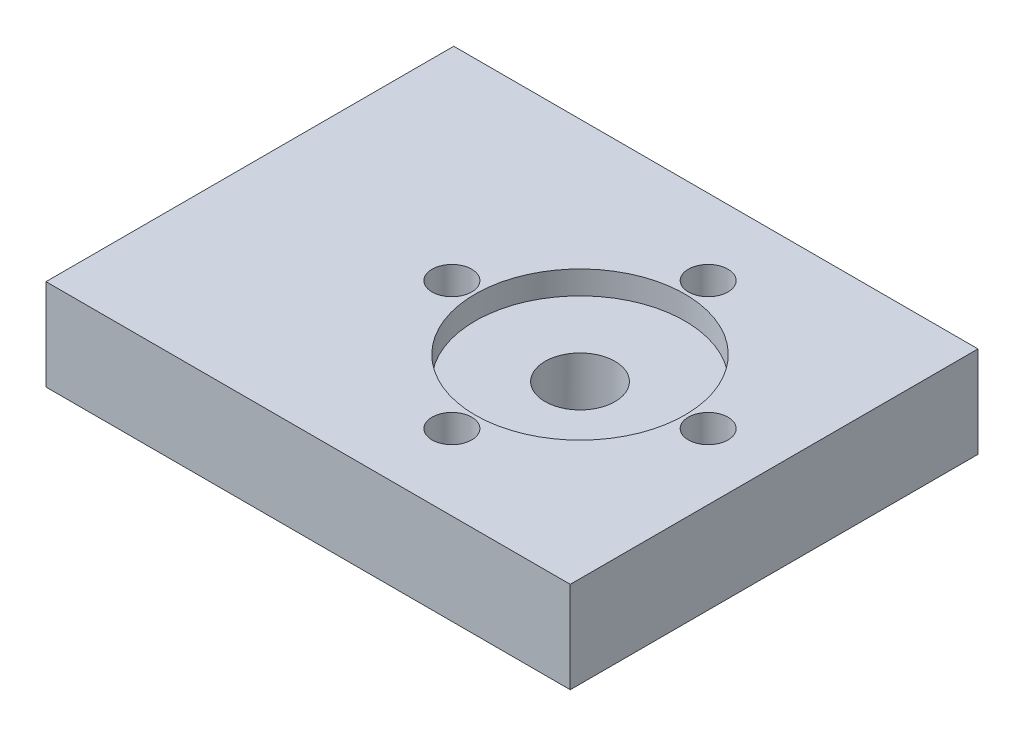
ISO-10303-21;
HEADER;
FILE_DESCRIPTION(('STEP AP214'),'2;1');
FILE_NAME('part.step','',(''),(''),'','','');
FILE_SCHEMA(('AUTOMOTIVE_DESIGN { 1 0 10303 214 1 1 1 1 }'));
ENDSEC;
DATA;
#1=APPLICATION_CONTEXT('core data for automotive mechanical design processes');
#2=APPLICATION_PROTOCOL_DEFINITION('international standard','automotive_design',2000,#1);
#3=PRODUCT_CONTEXT('',#1,'mechanical');
#4=PRODUCT('Part','Part','',(#3));
#5=PRODUCT_RELATED_PRODUCT_CATEGORY('part','',(#4));
#6=PRODUCT_DEFINITION_FORMATION('','',#4);
#7=PRODUCT_DEFINITION_CONTEXT('part definition',#1,'design');
#8=PRODUCT_DEFINITION('design','',#6,#7);
#9=PRODUCT_DEFINITION_SHAPE('','',#8);
#10=(LENGTH_UNIT() NAMED_UNIT(*) SI_UNIT(.MILLI.,.METRE.));
#11=(NAMED_UNIT(*) PLANE_ANGLE_UNIT() SI_UNIT($,.RADIAN.));
#12=(NAMED_UNIT(*) SI_UNIT($,.STERADIAN.) SOLID_ANGLE_UNIT());
#13=UNCERTAINTY_MEASURE_WITH_UNIT(LENGTH_MEASURE(1.E-05),#10,'distance_accuracy_value','');
#14=(GEOMETRIC_REPRESENTATION_CONTEXT(3) GLOBAL_UNCERTAINTY_ASSIGNED_CONTEXT((#13)) GLOBAL_UNIT_ASSIGNED_CONTEXT((#10,
#11,#12)) REPRESENTATION_CONTEXT('',''));
#15=CARTESIAN_POINT('',(0.,0.,0.));
#16=DIRECTION('',(0.,0.,1.));
#17=DIRECTION('',(1.,0.,0.));
#18=AXIS2_PLACEMENT_3D('',#15,#16,#17);
#19=CARTESIAN_POINT('',(22.5,7.83844459402521,17.5));
#20=DIRECTION('',(-1.,0.,0.));
#21=DIRECTION('',(0.,0.,1.));
#22=AXIS2_PLACEMENT_3D('',#19,#20,#21);
#23=PLANE('',#22);
#24=DIRECTION('',(0.,0.,-1.));
#25=VECTOR('',#24,1.);
#26=CARTESIAN_POINT('',(22.5,0.,17.5));
#27=LINE('',#26,#25);
#28=CARTESIAN_POINT('',(22.5,0.,17.5));
#29=VERTEX_POINT('',#28);
#30=CARTESIAN_POINT('',(22.5,0.,-17.5));
#31=VERTEX_POINT('',#30);
#32=EDGE_CURVE('E115',#29,#31,#27,.T.);
#33=ORIENTED_EDGE('',*,*,#32,.T.);
#34=DIRECTION('',(0.,-1.,0.));
#35=VECTOR('',#34,1.);
#36=CARTESIAN_POINT('',(22.5,7.83844459402521,-17.5));
#37=LINE('',#36,#35);
#38=CARTESIAN_POINT('',(22.5,7.83844459402521,-17.5));
#39=VERTEX_POINT('',#38);
#40=EDGE_CURVE('E11',#39,#31,#37,.T.);
#41=ORIENTED_EDGE('',*,*,#40,.F.);
#42=DIRECTION('',(0.,0.,-1.));
#43=VECTOR('',#42,1.);
#44=CARTESIAN_POINT('',(22.5,7.83844459402521,17.5));
#45=LINE('',#44,#43);
#46=CARTESIAN_POINT('',(22.5,7.83844459402521,17.5));
#47=VERTEX_POINT('',#46);
#48=EDGE_CURVE('E98',#47,#39,#45,.T.);
#49=ORIENTED_EDGE('',*,*,#48,.F.);
#50=DIRECTION('',(0.,-1.,0.));
#51=VECTOR('',#50,1.);
#52=CARTESIAN_POINT('',(22.5,7.83844459402521,17.5));
#53=LINE('',#52,#51);
#54=EDGE_CURVE('E111',#47,#29,#53,.T.);
#55=ORIENTED_EDGE('',*,*,#54,.T.);
#56=EDGE_LOOP('',(#33,#41,#49,#55));
#57=FACE_BOUND('',#56,.T.);
#58=ADVANCED_FACE('F45',(#57),#23,.F.);
#59=CARTESIAN_POINT('',(-22.5,7.83844459402521,-17.5));
#60=DIRECTION('',(0.,0.,1.));
#61=DIRECTION('',(1.,0.,0.));
#62=AXIS2_PLACEMENT_3D('',#59,#60,#61);
#63=PLANE('',#62);
#64=DIRECTION('',(-1.,0.,0.));
#65=VECTOR('',#64,1.);
#66=CARTESIAN_POINT('',(-22.5,0.,-17.5));
#67=LINE('',#66,#65);
#68=CARTESIAN_POINT('',(-22.5,0.,-17.5));
#69=VERTEX_POINT('',#68);
#70=EDGE_CURVE('E103',#31,#69,#67,.T.);
#71=ORIENTED_EDGE('',*,*,#70,.T.);
#72=DIRECTION('',(0.,-1.,0.));
#73=VECTOR('',#72,1.);
#74=CARTESIAN_POINT('',(-22.5,7.83844459402521,-17.5));
#75=LINE('',#74,#73);
#76=CARTESIAN_POINT('',(-22.5,7.83844459402521,-17.5));
#77=VERTEX_POINT('',#76);
#78=EDGE_CURVE('E55',#77,#69,#75,.T.);
#79=ORIENTED_EDGE('',*,*,#78,.F.);
#80=DIRECTION('',(-1.,0.,0.));
#81=VECTOR('',#80,1.);
#82=CARTESIAN_POINT('',(-22.5,7.83844459402521,-17.5));
#83=LINE('',#82,#81);
#84=EDGE_CURVE('E93',#39,#77,#83,.T.);
#85=ORIENTED_EDGE('',*,*,#84,.F.);
#86=ORIENTED_EDGE('',*,*,#40,.T.);
#87=EDGE_LOOP('',(#71,#79,#85,#86));
#88=FACE_BOUND('',#87,.T.);
#89=ADVANCED_FACE('F102',(#88),#63,.F.);
#90=CARTESIAN_POINT('',(-22.5,7.83844459402521,17.5));
#91=DIRECTION('',(1.,0.,0.));
#92=DIRECTION('',(0.,0.,-1.));
#93=AXIS2_PLACEMENT_3D('',#90,#91,#92);
#94=PLANE('',#93);
#95=DIRECTION('',(0.,0.,1.));
#96=VECTOR('',#95,1.);
#97=CARTESIAN_POINT('',(-22.5,0.,17.5));
#98=LINE('',#97,#96);
#99=CARTESIAN_POINT('',(-22.5,0.,17.5));
#100=VERTEX_POINT('',#99);
#101=EDGE_CURVE('E80',#69,#100,#98,.T.);
#102=ORIENTED_EDGE('',*,*,#101,.T.);
#103=DIRECTION('',(0.,-1.,0.));
#104=VECTOR('',#103,1.);
#105=CARTESIAN_POINT('',(-22.5,7.83844459402521,17.5));
#106=LINE('',#105,#104);
#107=CARTESIAN_POINT('',(-22.5,7.83844459402521,17.5));
#108=VERTEX_POINT('',#107);
#109=EDGE_CURVE('E105',#108,#100,#106,.T.);
#110=ORIENTED_EDGE('',*,*,#109,.F.);
#111=DIRECTION('',(0.,0.,1.));
#112=VECTOR('',#111,1.);
#113=CARTESIAN_POINT('',(-22.5,7.83844459402521,17.5));
#114=LINE('',#113,#112);
#115=EDGE_CURVE('E96',#77,#108,#114,.T.);
#116=ORIENTED_EDGE('',*,*,#115,.F.);
#117=ORIENTED_EDGE('',*,*,#78,.T.);
#118=EDGE_LOOP('',(#102,#110,#116,#117));
#119=FACE_BOUND('',#118,.T.);
#120=ADVANCED_FACE('F107',(#119),#94,.F.);
#121=CARTESIAN_POINT('',(-22.5,7.83844459402521,17.5));
#122=DIRECTION('',(0.,0.,-1.));
#123=DIRECTION('',(-1.,0.,0.));
#124=AXIS2_PLACEMENT_3D('',#121,#122,#123);
#125=PLANE('',#124);
#126=DIRECTION('',(1.,0.,0.));
#127=VECTOR('',#126,1.);
#128=CARTESIAN_POINT('',(-22.5,0.,17.5));
#129=LINE('',#128,#127);
#130=EDGE_CURVE('E86',#100,#29,#129,.T.);
#131=ORIENTED_EDGE('',*,*,#130,.T.);
#132=ORIENTED_EDGE('',*,*,#54,.F.);
#133=DIRECTION('',(1.,0.,0.));
#134=VECTOR('',#133,1.);
#135=CARTESIAN_POINT('',(-22.5,7.83844459402521,17.5));
#136=LINE('',#135,#134);
#137=EDGE_CURVE('E63',#108,#47,#136,.T.);
#138=ORIENTED_EDGE('',*,*,#137,.F.);
#139=ORIENTED_EDGE('',*,*,#109,.T.);
#140=EDGE_LOOP('',(#131,#132,#138,#139));
#141=FACE_BOUND('',#140,.T.);
#142=ADVANCED_FACE('F129',(#141),#125,.F.);
#143=CARTESIAN_POINT('',(0.,7.83844459402521,0.));
#144=DIRECTION('',(0.,-1.,0.));
#145=DIRECTION('',(0.,0.,-1.));
#146=AXIS2_PLACEMENT_3D('',#143,#144,#145);
#147=PLANE('',#146);
#148=CARTESIAN_POINT('',(5.83999999999999,7.83844459402521,-11.));
#149=DIRECTION('',(0.,1.,0.));
#150=DIRECTION('',(0.,0.,1.));
#151=AXIS2_PLACEMENT_3D('',#148,#149,#150);
#152=CIRCLE('',#151,1.7);
#153=CARTESIAN_POINT('',(5.83999999999999,7.83844459402521,-9.3));
#154=VERTEX_POINT('',#153);
#155=EDGE_CURVE('E156',#154,#154,#152,.T.);
#156=ORIENTED_EDGE('',*,*,#155,.F.);
#157=EDGE_LOOP('',(#156));
#158=FACE_BOUND('',#157,.T.);
#159=CARTESIAN_POINT('',(-5.15999999999985,7.83844459402521,0.));
#160=DIRECTION('',(0.,1.,0.));
#161=DIRECTION('',(0.,0.,1.));
#162=AXIS2_PLACEMENT_3D('',#159,#160,#161);
#163=CIRCLE('',#162,1.7);
#164=CARTESIAN_POINT('',(-5.15999999999985,7.83844459402521,1.70000000000004));
#165=VERTEX_POINT('',#164);
#166=EDGE_CURVE('E157',#165,#165,#163,.T.);
#167=ORIENTED_EDGE('',*,*,#166,.F.);
#168=EDGE_LOOP('',(#167));
#169=FACE_BOUND('',#168,.T.);
#170=CARTESIAN_POINT('',(5.84000000000022,7.83844459402521,11.));
#171=DIRECTION('',(0.,1.,0.));
#172=DIRECTION('',(0.,0.,1.));
#173=AXIS2_PLACEMENT_3D('',#170,#171,#172);
#174=CIRCLE('',#173,1.7);
#175=CARTESIAN_POINT('',(5.84000000000022,7.83844459402521,12.7));
#176=VERTEX_POINT('',#175);
#177=EDGE_CURVE('E152',#176,#176,#174,.T.);
#178=ORIENTED_EDGE('',*,*,#177,.F.);
#179=EDGE_LOOP('',(#178));
#180=FACE_BOUND('',#179,.T.);
#181=CARTESIAN_POINT('',(16.8400000000001,7.83844459402521,-1.14491749414469E-13));
#182=DIRECTION('',(0.,1.,0.));
#183=DIRECTION('',(0.,0.,1.));
#184=AXIS2_PLACEMENT_3D('',#181,#182,#183);
#185=CIRCLE('',#184,1.7);
#186=CARTESIAN_POINT('',(16.8400000000001,7.83844459402521,1.69999999999989));
#187=VERTEX_POINT('',#186);
#188=EDGE_CURVE('E143',#187,#187,#185,.T.);
#189=ORIENTED_EDGE('',*,*,#188,.F.);
#190=EDGE_LOOP('',(#189));
#191=FACE_BOUND('',#190,.T.);
#192=CARTESIAN_POINT('',(5.84,7.83844459402521,0.));
#193=DIRECTION('',(0.,1.,0.));
#194=DIRECTION('',(0.,0.,1.));
#195=AXIS2_PLACEMENT_3D('',#192,#193,#194);
#196=CIRCLE('',#195,9.00000000000001);
#197=CARTESIAN_POINT('',(5.84,7.83844459402521,9.00000000000001));
#198=VERTEX_POINT('',#197);
#199=EDGE_CURVE('E136',#198,#198,#196,.T.);
#200=ORIENTED_EDGE('',*,*,#199,.F.);
#201=EDGE_LOOP('',(#200));
#202=FACE_BOUND('',#201,.T.);
#203=ORIENTED_EDGE('',*,*,#48,.T.);
#204=ORIENTED_EDGE('',*,*,#84,.T.);
#205=ORIENTED_EDGE('',*,*,#115,.T.);
#206=ORIENTED_EDGE('',*,*,#137,.T.);
#207=EDGE_LOOP('',(#203,#204,#205,#206));
#208=FACE_BOUND('',#207,.T.);
#209=ADVANCED_FACE('F94',(#158,#169,#180,#191,#202,#208),#147,.F.);
#210=CARTESIAN_POINT('',(0.,0.,0.));
#211=DIRECTION('',(0.,-1.,0.));
#212=DIRECTION('',(0.,0.,-1.));
#213=AXIS2_PLACEMENT_3D('',#210,#211,#212);
#214=PLANE('',#213);
#215=CARTESIAN_POINT('',(5.83999999999999,0.,-11.));
#216=DIRECTION('',(0.,-1.,0.));
#217=DIRECTION('',(0.,0.,-1.));
#218=AXIS2_PLACEMENT_3D('',#215,#216,#217);
#219=CIRCLE('',#218,1.7);
#220=CARTESIAN_POINT('',(5.83999999999999,0.,-12.7));
#221=VERTEX_POINT('',#220);
#222=EDGE_CURVE('E172',#221,#221,#219,.F.);
#223=ORIENTED_EDGE('',*,*,#222,.T.);
#224=EDGE_LOOP('',(#223));
#225=FACE_BOUND('',#224,.T.);
#226=CARTESIAN_POINT('',(-5.15999999999985,0.,0.));
#227=DIRECTION('',(0.,-1.,0.));
#228=DIRECTION('',(0.,0.,-1.));
#229=AXIS2_PLACEMENT_3D('',#226,#227,#228);
#230=CIRCLE('',#229,1.7);
#231=CARTESIAN_POINT('',(-5.15999999999985,0.,-1.69999999999996));
#232=VERTEX_POINT('',#231);
#233=EDGE_CURVE('E162',#232,#232,#230,.F.);
#234=ORIENTED_EDGE('',*,*,#233,.T.);
#235=EDGE_LOOP('',(#234));
#236=FACE_BOUND('',#235,.T.);
#237=CARTESIAN_POINT('',(5.84000000000022,0.,11.));
#238=DIRECTION('',(0.,-1.,0.));
#239=DIRECTION('',(0.,0.,-1.));
#240=AXIS2_PLACEMENT_3D('',#237,#238,#239);
#241=CIRCLE('',#240,1.7);
#242=CARTESIAN_POINT('',(5.84000000000022,0.,9.3));
#243=VERTEX_POINT('',#242);
#244=EDGE_CURVE('E161',#243,#243,#241,.F.);
#245=ORIENTED_EDGE('',*,*,#244,.T.);
#246=EDGE_LOOP('',(#245));
#247=FACE_BOUND('',#246,.T.);
#248=CARTESIAN_POINT('',(16.8400000000001,0.,-1.14491749414469E-13));
#249=DIRECTION('',(0.,-1.,0.));
#250=DIRECTION('',(0.,0.,-1.));
#251=AXIS2_PLACEMENT_3D('',#248,#249,#250);
#252=CIRCLE('',#251,1.7);
#253=CARTESIAN_POINT('',(16.8400000000001,0.,-1.70000000000011));
#254=VERTEX_POINT('',#253);
#255=EDGE_CURVE('E148',#254,#254,#252,.F.);
#256=ORIENTED_EDGE('',*,*,#255,.T.);
#257=EDGE_LOOP('',(#256));
#258=FACE_BOUND('',#257,.T.);
#259=CARTESIAN_POINT('',(5.84,0.,0.));
#260=DIRECTION('',(0.,-1.,0.));
#261=DIRECTION('',(0.,0.,-1.));
#262=AXIS2_PLACEMENT_3D('',#259,#260,#261);
#263=CIRCLE('',#262,3.);
#264=CARTESIAN_POINT('',(5.84,0.,-3.));
#265=VERTEX_POINT('',#264);
#266=EDGE_CURVE('E147',#265,#265,#263,.F.);
#267=ORIENTED_EDGE('',*,*,#266,.T.);
#268=EDGE_LOOP('',(#267));
#269=FACE_BOUND('',#268,.T.);
#270=ORIENTED_EDGE('',*,*,#32,.F.);
#271=ORIENTED_EDGE('',*,*,#130,.F.);
#272=ORIENTED_EDGE('',*,*,#101,.F.);
#273=ORIENTED_EDGE('',*,*,#70,.F.);
#274=EDGE_LOOP('',(#270,#271,#272,#273));
#275=FACE_BOUND('',#274,.T.);
#276=ADVANCED_FACE('F132',(#225,#236,#247,#258,#269,#275),#214,.T.);
#277=CARTESIAN_POINT('',(5.84,5.83844459402521,0.));
#278=DIRECTION('',(0.,1.,0.));
#279=DIRECTION('',(0.,0.,1.));
#280=AXIS2_PLACEMENT_3D('',#277,#278,#279);
#281=CYLINDRICAL_SURFACE('',#280,9.00000000000001);
#282=CARTESIAN_POINT('',(5.84,5.83844459402521,0.));
#283=DIRECTION('',(0.,1.,0.));
#284=DIRECTION('',(0.,0.,1.));
#285=AXIS2_PLACEMENT_3D('',#282,#283,#284);
#286=CIRCLE('',#285,9.00000000000001);
#287=CARTESIAN_POINT('',(5.84,5.83844459402521,9.00000000000001));
#288=VERTEX_POINT('',#287);
#289=EDGE_CURVE('E119',#288,#288,#286,.T.);
#290=ORIENTED_EDGE('',*,*,#289,.F.);
#291=EDGE_LOOP('',(#290));
#292=FACE_BOUND('',#291,.T.);
#293=ORIENTED_EDGE('',*,*,#199,.T.);
#294=EDGE_LOOP('',(#293));
#295=FACE_BOUND('',#294,.T.);
#296=ADVANCED_FACE('F194',(#292,#295),#281,.F.);
#297=CARTESIAN_POINT('',(5.84,5.83844459402521,0.));
#298=DIRECTION('',(0.,1.,0.));
#299=DIRECTION('',(0.,0.,1.));
#300=AXIS2_PLACEMENT_3D('',#297,#298,#299);
#301=PLANE('',#300);
#302=CARTESIAN_POINT('',(5.84,5.83844459402521,0.));
#303=DIRECTION('',(0.,1.,0.));
#304=DIRECTION('',(0.,0.,1.));
#305=AXIS2_PLACEMENT_3D('',#302,#303,#304);
#306=CIRCLE('',#305,3.);
#307=CARTESIAN_POINT('',(5.84,5.83844459402521,3.));
#308=VERTEX_POINT('',#307);
#309=EDGE_CURVE('E48',#308,#308,#306,.T.);
#310=ORIENTED_EDGE('',*,*,#309,.F.);
#311=EDGE_LOOP('',(#310));
#312=FACE_BOUND('',#311,.T.);
#313=ORIENTED_EDGE('',*,*,#289,.T.);
#314=EDGE_LOOP('',(#313));
#315=FACE_BOUND('',#314,.T.);
#316=ADVANCED_FACE('F196',(#312,#315),#301,.T.);
#317=CARTESIAN_POINT('',(5.84,-8.48528137423857,0.));
#318=DIRECTION('',(0.,1.,0.));
#319=DIRECTION('',(0.,0.,1.));
#320=AXIS2_PLACEMENT_3D('',#317,#318,#319);
#321=CYLINDRICAL_SURFACE('',#320,3.);
#322=ORIENTED_EDGE('',*,*,#309,.T.);
#323=EDGE_LOOP('',(#322));
#324=FACE_BOUND('',#323,.T.);
#325=ORIENTED_EDGE('',*,*,#266,.F.);
#326=EDGE_LOOP('',(#325));
#327=FACE_BOUND('',#326,.T.);
#328=ADVANCED_FACE('F203',(#324,#327),#321,.F.);
#329=CARTESIAN_POINT('',(16.8400000000001,-8.48528137423857,-1.14491749414469E-13));
#330=DIRECTION('',(0.,1.,0.));
#331=DIRECTION('',(0.,0.,1.));
#332=AXIS2_PLACEMENT_3D('',#329,#330,#331);
#333=CYLINDRICAL_SURFACE('',#332,1.7);
#334=ORIENTED_EDGE('',*,*,#188,.T.);
#335=EDGE_LOOP('',(#334));
#336=FACE_BOUND('',#335,.T.);
#337=ORIENTED_EDGE('',*,*,#255,.F.);
#338=EDGE_LOOP('',(#337));
#339=FACE_BOUND('',#338,.T.);
#340=ADVANCED_FACE('F263',(#336,#339),#333,.F.);
#341=CARTESIAN_POINT('',(5.84000000000022,-8.48528137423857,11.));
#342=DIRECTION('',(0.,1.,0.));
#343=DIRECTION('',(0.,0.,1.));
#344=AXIS2_PLACEMENT_3D('',#341,#342,#343);
#345=CYLINDRICAL_SURFACE('',#344,1.7);
#346=ORIENTED_EDGE('',*,*,#177,.T.);
#347=EDGE_LOOP('',(#346));
#348=FACE_BOUND('',#347,.T.);
#349=ORIENTED_EDGE('',*,*,#244,.F.);
#350=EDGE_LOOP('',(#349));
#351=FACE_BOUND('',#350,.T.);
#352=ADVANCED_FACE('F272',(#348,#351),#345,.F.);
#353=CARTESIAN_POINT('',(-5.15999999999985,-8.48528137423857,0.));
#354=DIRECTION('',(0.,1.,0.));
#355=DIRECTION('',(0.,0.,1.));
#356=AXIS2_PLACEMENT_3D('',#353,#354,#355);
#357=CYLINDRICAL_SURFACE('',#356,1.7);
#358=ORIENTED_EDGE('',*,*,#166,.T.);
#359=EDGE_LOOP('',(#358));
#360=FACE_BOUND('',#359,.T.);
#361=ORIENTED_EDGE('',*,*,#233,.F.);
#362=EDGE_LOOP('',(#361));
#363=FACE_BOUND('',#362,.T.);
#364=ADVANCED_FACE('F281',(#360,#363),#357,.F.);
#365=CARTESIAN_POINT('',(5.83999999999999,-8.48528137423857,-11.));
#366=DIRECTION('',(0.,1.,0.));
#367=DIRECTION('',(0.,0.,1.));
#368=AXIS2_PLACEMENT_3D('',#365,#366,#367);
#369=CYLINDRICAL_SURFACE('',#368,1.7);
#370=ORIENTED_EDGE('',*,*,#155,.T.);
#371=EDGE_LOOP('',(#370));
#372=FACE_BOUND('',#371,.T.);
#373=ORIENTED_EDGE('',*,*,#222,.F.);
#374=EDGE_LOOP('',(#373));
#375=FACE_BOUND('',#374,.T.);
#376=ADVANCED_FACE('F180',(#372,#375),#369,.F.);
#377=CLOSED_SHELL('',(#58,#89,#120,#142,#209,#276,#296,#316,#328,#340,#352,#364,#376));
#378=MANIFOLD_SOLID_BREP('B2',#377);
#379=ADVANCED_BREP_SHAPE_REPRESENTATION('',(#18,#378),#14);
#380=SHAPE_DEFINITION_REPRESENTATION(#9,#379);
ENDSEC;
END-ISO-10303-21;
